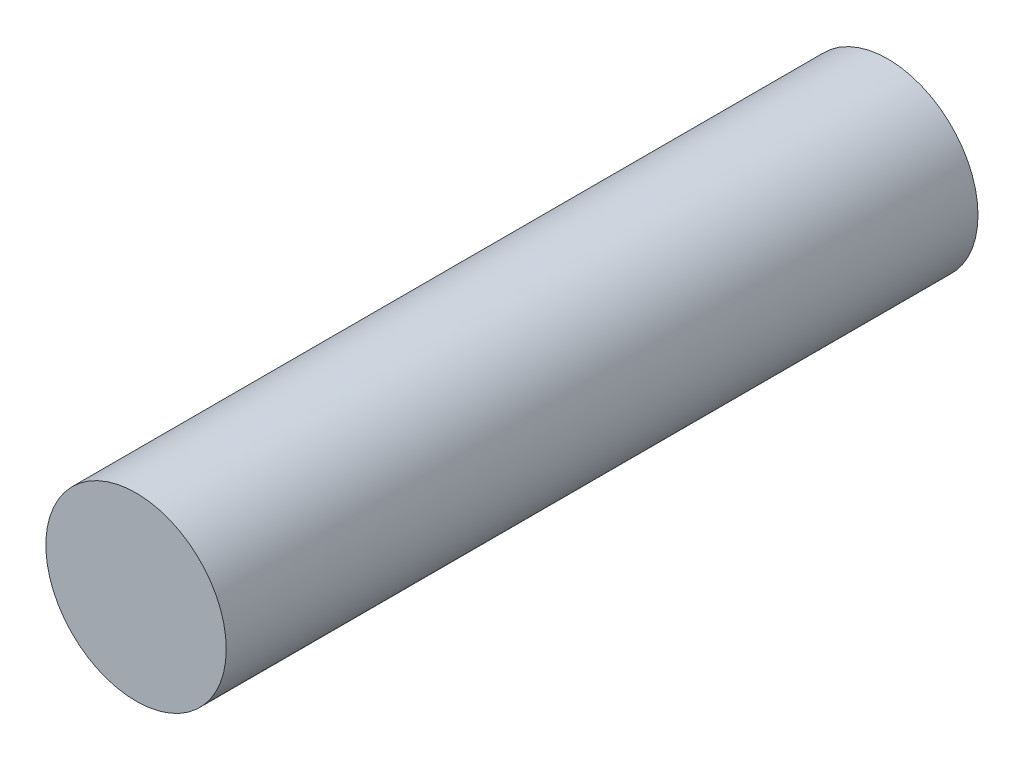
ISO-10303-21;
HEADER;
FILE_DESCRIPTION(('STEP AP214'),'2;1');
FILE_NAME('part.step','',(''),(''),'','','');
FILE_SCHEMA(('AUTOMOTIVE_DESIGN { 1 0 10303 214 1 1 1 1 }'));
ENDSEC;
DATA;
#1=APPLICATION_CONTEXT('core data for automotive mechanical design processes');
#2=APPLICATION_PROTOCOL_DEFINITION('international standard','automotive_design',2000,#1);
#3=PRODUCT_CONTEXT('',#1,'mechanical');
#4=PRODUCT('Part','Part','',(#3));
#5=PRODUCT_RELATED_PRODUCT_CATEGORY('part','',(#4));
#6=PRODUCT_DEFINITION_FORMATION('','',#4);
#7=PRODUCT_DEFINITION_CONTEXT('part definition',#1,'design');
#8=PRODUCT_DEFINITION('design','',#6,#7);
#9=PRODUCT_DEFINITION_SHAPE('','',#8);
#10=(LENGTH_UNIT() NAMED_UNIT(*) SI_UNIT(.MILLI.,.METRE.));
#11=(NAMED_UNIT(*) PLANE_ANGLE_UNIT() SI_UNIT($,.RADIAN.));
#12=(NAMED_UNIT(*) SI_UNIT($,.STERADIAN.) SOLID_ANGLE_UNIT());
#13=UNCERTAINTY_MEASURE_WITH_UNIT(LENGTH_MEASURE(1.E-05),#10,'distance_accuracy_value','');
#14=(GEOMETRIC_REPRESENTATION_CONTEXT(3) GLOBAL_UNCERTAINTY_ASSIGNED_CONTEXT((#13)) GLOBAL_UNIT_ASSIGNED_CONTEXT((#10,
#11,#12)) REPRESENTATION_CONTEXT('',''));
#15=CARTESIAN_POINT('',(0.,0.,0.));
#16=DIRECTION('',(0.,0.,1.));
#17=DIRECTION('',(1.,0.,0.));
#18=AXIS2_PLACEMENT_3D('',#15,#16,#17);
#19=CARTESIAN_POINT('',(0.,0.,50.));
#20=DIRECTION('',(0.,0.,-1.));
#21=DIRECTION('',(-1.,0.,0.));
#22=AXIS2_PLACEMENT_3D('',#19,#20,#21);
#23=CYLINDRICAL_SURFACE('',#22,6.);
#24=CARTESIAN_POINT('',(0.,0.,50.));
#25=DIRECTION('',(0.,0.,1.));
#26=DIRECTION('',(1.,0.,0.));
#27=AXIS2_PLACEMENT_3D('',#24,#25,#26);
#28=CIRCLE('',#27,6.);
#29=CARTESIAN_POINT('',(6.,0.,50.));
#30=VERTEX_POINT('',#29);
#31=EDGE_CURVE('E10',#30,#30,#28,.T.);
#32=ORIENTED_EDGE('',*,*,#31,.F.);
#33=EDGE_LOOP('',(#32));
#34=FACE_BOUND('',#33,.T.);
#35=CARTESIAN_POINT('',(0.,0.,0.));
#36=DIRECTION('',(0.,0.,1.));
#37=DIRECTION('',(1.,0.,0.));
#38=AXIS2_PLACEMENT_3D('',#35,#36,#37);
#39=CIRCLE('',#38,6.);
#40=CARTESIAN_POINT('',(6.,0.,0.));
#41=VERTEX_POINT('',#40);
#42=EDGE_CURVE('E33',#41,#41,#39,.T.);
#43=ORIENTED_EDGE('',*,*,#42,.T.);
#44=EDGE_LOOP('',(#43));
#45=FACE_BOUND('',#44,.T.);
#46=ADVANCED_FACE('F30',(#34,#45),#23,.T.);
#47=CARTESIAN_POINT('',(0.,0.,50.));
#48=DIRECTION('',(0.,0.,1.));
#49=DIRECTION('',(1.,0.,0.));
#50=AXIS2_PLACEMENT_3D('',#47,#48,#49);
#51=PLANE('',#50);
#52=ORIENTED_EDGE('',*,*,#31,.T.);
#53=EDGE_LOOP('',(#52));
#54=FACE_BOUND('',#53,.T.);
#55=ADVANCED_FACE('F45',(#54),#51,.T.);
#56=CARTESIAN_POINT('',(0.,0.,0.));
#57=DIRECTION('',(0.,0.,1.));
#58=DIRECTION('',(1.,0.,0.));
#59=AXIS2_PLACEMENT_3D('',#56,#57,#58);
#60=PLANE('',#59);
#61=ORIENTED_EDGE('',*,*,#42,.F.);
#62=EDGE_LOOP('',(#61));
#63=FACE_BOUND('',#62,.T.);
#64=ADVANCED_FACE('F43',(#63),#60,.F.);
#65=CLOSED_SHELL('',(#46,#55,#64));
#66=MANIFOLD_SOLID_BREP('B2',#65);
#67=ADVANCED_BREP_SHAPE_REPRESENTATION('',(#18,#66),#14);
#68=SHAPE_DEFINITION_REPRESENTATION(#9,#67);
ENDSEC;
END-ISO-10303-21;
